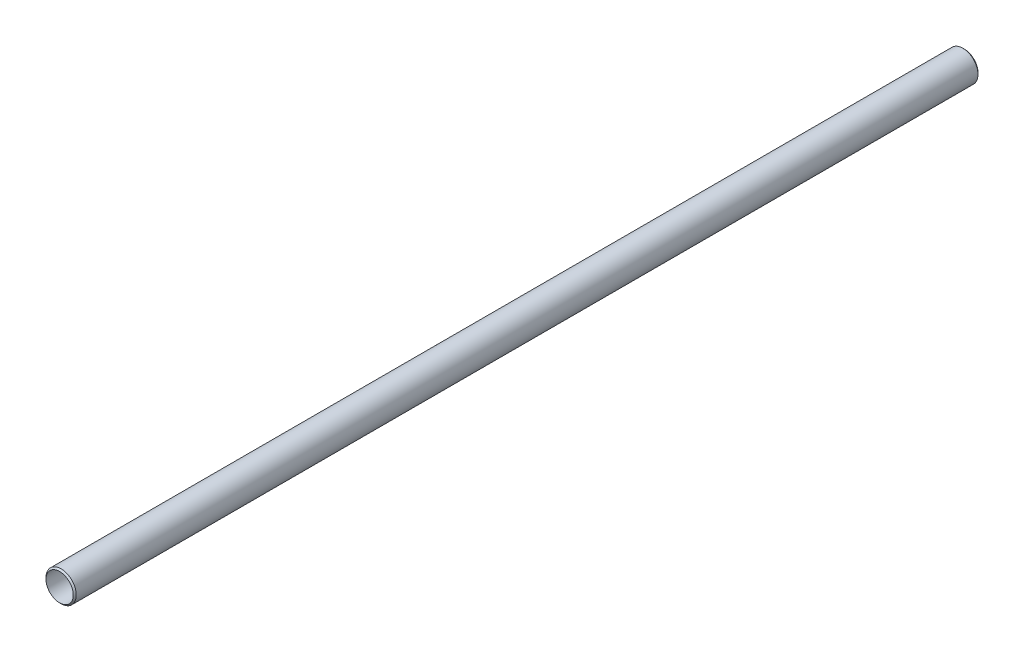
ISO-10303-21;
HEADER;
FILE_DESCRIPTION(('STEP AP214'),'2;1');
FILE_NAME('part.step','',(''),(''),'','','');
FILE_SCHEMA(('AUTOMOTIVE_DESIGN { 1 0 10303 214 1 1 1 1 }'));
ENDSEC;
DATA;
#1=APPLICATION_CONTEXT('core data for automotive mechanical design processes');
#2=APPLICATION_PROTOCOL_DEFINITION('international standard','automotive_design',2000,#1);
#3=PRODUCT_CONTEXT('',#1,'mechanical');
#4=PRODUCT('Part','Part','',(#3));
#5=PRODUCT_RELATED_PRODUCT_CATEGORY('part','',(#4));
#6=PRODUCT_DEFINITION_FORMATION('','',#4);
#7=PRODUCT_DEFINITION_CONTEXT('part definition',#1,'design');
#8=PRODUCT_DEFINITION('design','',#6,#7);
#9=PRODUCT_DEFINITION_SHAPE('','',#8);
#10=(LENGTH_UNIT() NAMED_UNIT(*) SI_UNIT(.MILLI.,.METRE.));
#11=(NAMED_UNIT(*) PLANE_ANGLE_UNIT() SI_UNIT($,.RADIAN.));
#12=(NAMED_UNIT(*) SI_UNIT($,.STERADIAN.) SOLID_ANGLE_UNIT());
#13=UNCERTAINTY_MEASURE_WITH_UNIT(LENGTH_MEASURE(1.E-05),#10,'distance_accuracy_value','');
#14=(GEOMETRIC_REPRESENTATION_CONTEXT(3) GLOBAL_UNCERTAINTY_ASSIGNED_CONTEXT((#13)) GLOBAL_UNIT_ASSIGNED_CONTEXT((#10,
#11,#12)) REPRESENTATION_CONTEXT('',''));
#15=CARTESIAN_POINT('',(0.,0.,0.));
#16=DIRECTION('',(0.,0.,1.));
#17=DIRECTION('',(1.,0.,0.));
#18=AXIS2_PLACEMENT_3D('',#15,#16,#17);
#19=CARTESIAN_POINT('',(0.,0.,300.));
#20=DIRECTION('',(0.,0.,-1.));
#21=DIRECTION('',(-1.,0.,0.));
#22=AXIS2_PLACEMENT_3D('',#19,#20,#21);
#23=CYLINDRICAL_SURFACE('',#22,5.);
#24=CARTESIAN_POINT('',(0.,0.,1.));
#25=DIRECTION('',(0.,0.,1.));
#26=DIRECTION('',(1.,0.,0.));
#27=AXIS2_PLACEMENT_3D('',#24,#25,#26);
#28=CIRCLE('',#27,5.);
#29=CARTESIAN_POINT('',(5.,0.,1.));
#30=VERTEX_POINT('',#29);
#31=EDGE_CURVE('E42',#30,#30,#28,.T.);
#32=ORIENTED_EDGE('',*,*,#31,.T.);
#33=EDGE_LOOP('',(#32));
#34=FACE_BOUND('',#33,.T.);
#35=CARTESIAN_POINT('',(0.,0.,299.));
#36=DIRECTION('',(0.,0.,1.));
#37=DIRECTION('',(1.,0.,0.));
#38=AXIS2_PLACEMENT_3D('',#35,#36,#37);
#39=CIRCLE('',#38,5.);
#40=CARTESIAN_POINT('',(5.,0.,299.));
#41=VERTEX_POINT('',#40);
#42=EDGE_CURVE('E46',#41,#41,#39,.F.);
#43=ORIENTED_EDGE('',*,*,#42,.T.);
#44=EDGE_LOOP('',(#43));
#45=FACE_BOUND('',#44,.T.);
#46=ADVANCED_FACE('F31',(#34,#45),#23,.T.);
#47=CARTESIAN_POINT('',(0.,0.,300.));
#48=DIRECTION('',(0.,0.,-1.));
#49=DIRECTION('',(-1.,0.,0.));
#50=AXIS2_PLACEMENT_3D('',#47,#48,#49);
#51=CYLINDRICAL_SURFACE('',#50,4.5);
#52=CARTESIAN_POINT('',(0.,0.,0.500000000000003));
#53=DIRECTION('',(0.,0.,1.));
#54=DIRECTION('',(1.,0.,0.));
#55=AXIS2_PLACEMENT_3D('',#52,#53,#54);
#56=CIRCLE('',#55,4.5);
#57=CARTESIAN_POINT('',(4.5,0.,0.500000000000003));
#58=VERTEX_POINT('',#57);
#59=EDGE_CURVE('E10',#58,#58,#56,.F.);
#60=ORIENTED_EDGE('',*,*,#59,.T.);
#61=EDGE_LOOP('',(#60));
#62=FACE_BOUND('',#61,.T.);
#63=CARTESIAN_POINT('',(0.,0.,299.5));
#64=DIRECTION('',(0.,0.,-1.));
#65=DIRECTION('',(-1.,0.,0.));
#66=AXIS2_PLACEMENT_3D('',#63,#64,#65);
#67=CIRCLE('',#66,4.5);
#68=CARTESIAN_POINT('',(-4.5,0.,299.5));
#69=VERTEX_POINT('',#68);
#70=EDGE_CURVE('E38',#69,#69,#67,.F.);
#71=ORIENTED_EDGE('',*,*,#70,.T.);
#72=EDGE_LOOP('',(#71));
#73=FACE_BOUND('',#72,.T.);
#74=ADVANCED_FACE('F59',(#62,#73),#51,.F.);
#75=CARTESIAN_POINT('',(0.,0.,1.));
#76=DIRECTION('',(0.,0.,1.));
#77=DIRECTION('',(1.,0.,0.));
#78=AXIS2_PLACEMENT_3D('',#75,#76,#77);
#79=CONICAL_SURFACE('',#78,5.,0.785398163397451);
#80=ORIENTED_EDGE('',*,*,#59,.F.);
#81=EDGE_LOOP('',(#80));
#82=FACE_BOUND('',#81,.T.);
#83=ORIENTED_EDGE('',*,*,#31,.F.);
#84=EDGE_LOOP('',(#83));
#85=FACE_BOUND('',#84,.T.);
#86=ADVANCED_FACE('F55',(#82,#85),#79,.T.);
#87=CARTESIAN_POINT('',(0.,0.,300.));
#88=DIRECTION('',(0.,0.,-1.));
#89=DIRECTION('',(-1.,0.,0.));
#90=AXIS2_PLACEMENT_3D('',#87,#88,#89);
#91=CONICAL_SURFACE('',#90,3.99999999999998,0.785398163397457);
#92=ORIENTED_EDGE('',*,*,#42,.F.);
#93=EDGE_LOOP('',(#92));
#94=FACE_BOUND('',#93,.T.);
#95=ORIENTED_EDGE('',*,*,#70,.F.);
#96=EDGE_LOOP('',(#95));
#97=FACE_BOUND('',#96,.T.);
#98=ADVANCED_FACE('F33',(#94,#97),#91,.T.);
#99=CLOSED_SHELL('',(#46,#74,#86,#98));
#100=MANIFOLD_SOLID_BREP('B2',#99);
#101=ADVANCED_BREP_SHAPE_REPRESENTATION('',(#18,#100),#14);
#102=SHAPE_DEFINITION_REPRESENTATION(#9,#101);
ENDSEC;
END-ISO-10303-21;
